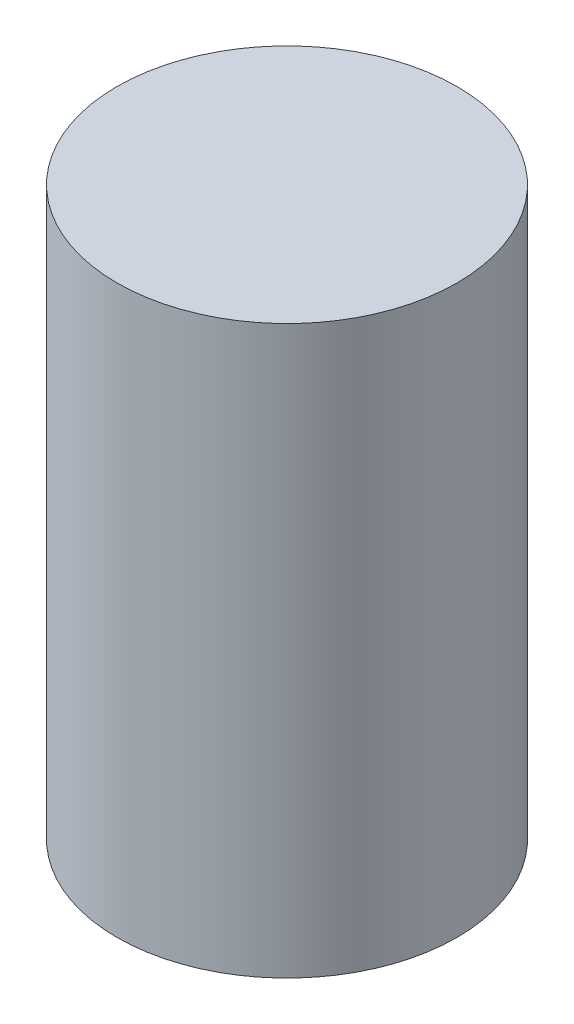
ISO-10303-21;
HEADER;
FILE_DESCRIPTION(('STEP AP214'),'2;1');
FILE_NAME('part.step','',(''),(''),'','','');
FILE_SCHEMA(('AUTOMOTIVE_DESIGN { 1 0 10303 214 1 1 1 1 }'));
ENDSEC;
DATA;
#1=APPLICATION_CONTEXT('core data for automotive mechanical design processes');
#2=APPLICATION_PROTOCOL_DEFINITION('international standard','automotive_design',2000,#1);
#3=PRODUCT_CONTEXT('',#1,'mechanical');
#4=PRODUCT('Part','Part','',(#3));
#5=PRODUCT_RELATED_PRODUCT_CATEGORY('part','',(#4));
#6=PRODUCT_DEFINITION_FORMATION('','',#4);
#7=PRODUCT_DEFINITION_CONTEXT('part definition',#1,'design');
#8=PRODUCT_DEFINITION('design','',#6,#7);
#9=PRODUCT_DEFINITION_SHAPE('','',#8);
#10=(LENGTH_UNIT() NAMED_UNIT(*) SI_UNIT(.MILLI.,.METRE.));
#11=(NAMED_UNIT(*) PLANE_ANGLE_UNIT() SI_UNIT($,.RADIAN.));
#12=(NAMED_UNIT(*) SI_UNIT($,.STERADIAN.) SOLID_ANGLE_UNIT());
#13=UNCERTAINTY_MEASURE_WITH_UNIT(LENGTH_MEASURE(1.E-05),#10,'distance_accuracy_value','');
#14=(GEOMETRIC_REPRESENTATION_CONTEXT(3) GLOBAL_UNCERTAINTY_ASSIGNED_CONTEXT((#13)) GLOBAL_UNIT_ASSIGNED_CONTEXT((#10,
#11,#12)) REPRESENTATION_CONTEXT('',''));
#15=CARTESIAN_POINT('',(0.,0.,0.));
#16=DIRECTION('',(0.,0.,1.));
#17=DIRECTION('',(1.,0.,0.));
#18=AXIS2_PLACEMENT_3D('',#15,#16,#17);
#19=CARTESIAN_POINT('',(-8.5222176357247,15.,-2.11453520284894));
#20=DIRECTION('',(0.,-1.,0.));
#21=DIRECTION('',(0.,0.,-1.));
#22=AXIS2_PLACEMENT_3D('',#19,#20,#21);
#23=CYLINDRICAL_SURFACE('',#22,4.5);
#24=CARTESIAN_POINT('',(-8.5222176357247,15.,-2.11453520284894));
#25=DIRECTION('',(0.,1.,0.));
#26=DIRECTION('',(0.,0.,1.));
#27=AXIS2_PLACEMENT_3D('',#24,#25,#26);
#28=CIRCLE('',#27,4.5);
#29=CARTESIAN_POINT('',(-8.5222176357247,15.,2.38546479715106));
#30=VERTEX_POINT('',#29);
#31=EDGE_CURVE('E10',#30,#30,#28,.T.);
#32=ORIENTED_EDGE('',*,*,#31,.F.);
#33=EDGE_LOOP('',(#32));
#34=FACE_BOUND('',#33,.T.);
#35=CARTESIAN_POINT('',(-8.5222176357247,0.,-2.11453520284894));
#36=DIRECTION('',(0.,1.,0.));
#37=DIRECTION('',(0.,0.,1.));
#38=AXIS2_PLACEMENT_3D('',#35,#36,#37);
#39=CIRCLE('',#38,4.5);
#40=CARTESIAN_POINT('',(-8.5222176357247,0.,2.38546479715106));
#41=VERTEX_POINT('',#40);
#42=EDGE_CURVE('E40',#41,#41,#39,.T.);
#43=ORIENTED_EDGE('',*,*,#42,.T.);
#44=EDGE_LOOP('',(#43));
#45=FACE_BOUND('',#44,.T.);
#46=ADVANCED_FACE('F37',(#34,#45),#23,.T.);
#47=CARTESIAN_POINT('',(-8.5222176357247,15.,-2.11453520284894));
#48=DIRECTION('',(0.,1.,0.));
#49=DIRECTION('',(0.,0.,1.));
#50=AXIS2_PLACEMENT_3D('',#47,#48,#49);
#51=PLANE('',#50);
#52=ORIENTED_EDGE('',*,*,#31,.T.);
#53=EDGE_LOOP('',(#52));
#54=FACE_BOUND('',#53,.T.);
#55=ADVANCED_FACE('F54',(#54),#51,.T.);
#56=CARTESIAN_POINT('',(-8.5222176357247,0.,-2.11453520284894));
#57=DIRECTION('',(0.,1.,0.));
#58=DIRECTION('',(0.,0.,1.));
#59=AXIS2_PLACEMENT_3D('',#56,#57,#58);
#60=PLANE('',#59);
#61=ORIENTED_EDGE('',*,*,#42,.F.);
#62=EDGE_LOOP('',(#61));
#63=FACE_BOUND('',#62,.T.);
#64=ADVANCED_FACE('F52',(#63),#60,.F.);
#65=CLOSED_SHELL('',(#46,#55,#64));
#66=MANIFOLD_SOLID_BREP('B2',#65);
#67=ADVANCED_BREP_SHAPE_REPRESENTATION('',(#18,#66),#14);
#68=SHAPE_DEFINITION_REPRESENTATION(#9,#67);
ENDSEC;
END-ISO-10303-21;
